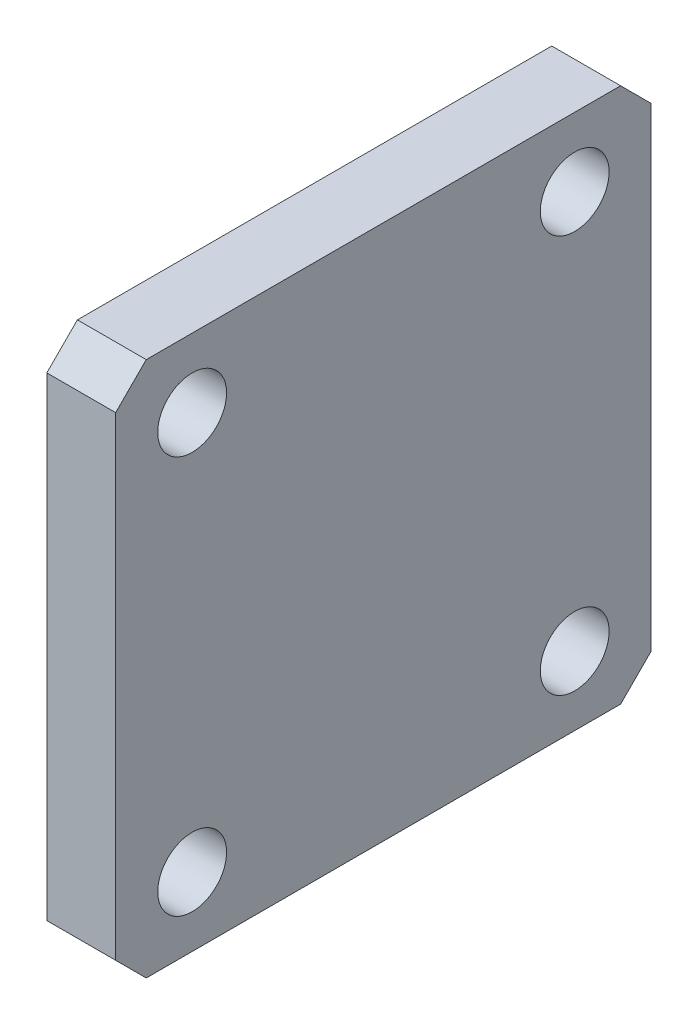
ISO-10303-21;
HEADER;
FILE_DESCRIPTION(('STEP AP214'),'2;1');
FILE_NAME('part.step','',(''),(''),'','','');
FILE_SCHEMA(('AUTOMOTIVE_DESIGN { 1 0 10303 214 1 1 1 1 }'));
ENDSEC;
DATA;
#1=APPLICATION_CONTEXT('core data for automotive mechanical design processes');
#2=APPLICATION_PROTOCOL_DEFINITION('international standard','automotive_design',2000,#1);
#3=PRODUCT_CONTEXT('',#1,'mechanical');
#4=PRODUCT('Part','Part','',(#3));
#5=PRODUCT_RELATED_PRODUCT_CATEGORY('part','',(#4));
#6=PRODUCT_DEFINITION_FORMATION('','',#4);
#7=PRODUCT_DEFINITION_CONTEXT('part definition',#1,'design');
#8=PRODUCT_DEFINITION('design','',#6,#7);
#9=PRODUCT_DEFINITION_SHAPE('','',#8);
#10=(LENGTH_UNIT() NAMED_UNIT(*) SI_UNIT(.MILLI.,.METRE.));
#11=(NAMED_UNIT(*) PLANE_ANGLE_UNIT() SI_UNIT($,.RADIAN.));
#12=(NAMED_UNIT(*) SI_UNIT($,.STERADIAN.) SOLID_ANGLE_UNIT());
#13=UNCERTAINTY_MEASURE_WITH_UNIT(LENGTH_MEASURE(1.E-05),#10,'distance_accuracy_value','');
#14=(GEOMETRIC_REPRESENTATION_CONTEXT(3) GLOBAL_UNCERTAINTY_ASSIGNED_CONTEXT((#13)) GLOBAL_UNIT_ASSIGNED_CONTEXT((#10,
#11,#12)) REPRESENTATION_CONTEXT('',''));
#15=CARTESIAN_POINT('',(0.,0.,0.));
#16=DIRECTION('',(0.,0.,1.));
#17=DIRECTION('',(1.,0.,0.));
#18=AXIS2_PLACEMENT_3D('',#15,#16,#17);
#19=CARTESIAN_POINT('',(4.5,-17.5,-17.5));
#20=DIRECTION('',(0.,0.,1.));
#21=DIRECTION('',(1.,0.,0.));
#22=AXIS2_PLACEMENT_3D('',#19,#20,#21);
#23=PLANE('',#22);
#24=DIRECTION('',(0.,1.,0.));
#25=VECTOR('',#24,1.);
#26=CARTESIAN_POINT('',(4.5,-17.5,-17.5));
#27=LINE('',#26,#25);
#28=CARTESIAN_POINT('',(4.5,-15.5,-17.5));
#29=VERTEX_POINT('',#28);
#30=CARTESIAN_POINT('',(4.5,15.5,-17.5));
#31=VERTEX_POINT('',#30);
#32=EDGE_CURVE('E118',#29,#31,#27,.T.);
#33=ORIENTED_EDGE('',*,*,#32,.F.);
#34=DIRECTION('',(-1.,0.,0.));
#35=VECTOR('',#34,1.);
#36=CARTESIAN_POINT('',(4.5,-15.5,-17.5));
#37=LINE('',#36,#35);
#38=CARTESIAN_POINT('',(0.,-15.5,-17.5));
#39=VERTEX_POINT('',#38);
#40=EDGE_CURVE('E103',#29,#39,#37,.T.);
#41=ORIENTED_EDGE('',*,*,#40,.T.);
#42=DIRECTION('',(0.,1.,0.));
#43=VECTOR('',#42,1.);
#44=CARTESIAN_POINT('',(0.,-17.5,-17.5));
#45=LINE('',#44,#43);
#46=CARTESIAN_POINT('',(0.,15.5,-17.5));
#47=VERTEX_POINT('',#46);
#48=EDGE_CURVE('E115',#39,#47,#45,.T.);
#49=ORIENTED_EDGE('',*,*,#48,.T.);
#50=DIRECTION('',(1.,0.,0.));
#51=VECTOR('',#50,1.);
#52=CARTESIAN_POINT('',(4.5,15.5,-17.5));
#53=LINE('',#52,#51);
#54=EDGE_CURVE('E120',#47,#31,#53,.T.);
#55=ORIENTED_EDGE('',*,*,#54,.T.);
#56=EDGE_LOOP('',(#33,#41,#49,#55));
#57=FACE_BOUND('',#56,.T.);
#58=ADVANCED_FACE('F32',(#57),#23,.F.);
#59=CARTESIAN_POINT('',(4.5,17.5,17.5));
#60=DIRECTION('',(0.,-1.,0.));
#61=DIRECTION('',(0.,0.,-1.));
#62=AXIS2_PLACEMENT_3D('',#59,#60,#61);
#63=PLANE('',#62);
#64=DIRECTION('',(0.,0.,1.));
#65=VECTOR('',#64,1.);
#66=CARTESIAN_POINT('',(4.5,17.5,17.5));
#67=LINE('',#66,#65);
#68=CARTESIAN_POINT('',(4.5,17.5,-15.5));
#69=VERTEX_POINT('',#68);
#70=CARTESIAN_POINT('',(4.5,17.5,15.5));
#71=VERTEX_POINT('',#70);
#72=EDGE_CURVE('E178',#69,#71,#67,.T.);
#73=ORIENTED_EDGE('',*,*,#72,.F.);
#74=DIRECTION('',(-1.,0.,0.));
#75=VECTOR('',#74,1.);
#76=CARTESIAN_POINT('',(4.5,17.5,-15.5));
#77=LINE('',#76,#75);
#78=CARTESIAN_POINT('',(0.,17.5,-15.5));
#79=VERTEX_POINT('',#78);
#80=EDGE_CURVE('E157',#69,#79,#77,.T.);
#81=ORIENTED_EDGE('',*,*,#80,.T.);
#82=DIRECTION('',(0.,0.,1.));
#83=VECTOR('',#82,1.);
#84=CARTESIAN_POINT('',(0.,17.5,17.5));
#85=LINE('',#84,#83);
#86=CARTESIAN_POINT('',(0.,17.5,15.5));
#87=VERTEX_POINT('',#86);
#88=EDGE_CURVE('E124',#79,#87,#85,.T.);
#89=ORIENTED_EDGE('',*,*,#88,.T.);
#90=DIRECTION('',(1.,0.,0.));
#91=VECTOR('',#90,1.);
#92=CARTESIAN_POINT('',(4.5,17.5,15.5));
#93=LINE('',#92,#91);
#94=EDGE_CURVE('E155',#87,#71,#93,.T.);
#95=ORIENTED_EDGE('',*,*,#94,.T.);
#96=EDGE_LOOP('',(#73,#81,#89,#95));
#97=FACE_BOUND('',#96,.T.);
#98=ADVANCED_FACE('F196',(#97),#63,.F.);
#99=CARTESIAN_POINT('',(4.5,-17.5,17.5));
#100=DIRECTION('',(0.,0.,-1.));
#101=DIRECTION('',(-1.,0.,0.));
#102=AXIS2_PLACEMENT_3D('',#99,#100,#101);
#103=PLANE('',#102);
#104=DIRECTION('',(0.,-1.,0.));
#105=VECTOR('',#104,1.);
#106=CARTESIAN_POINT('',(0.,-17.5,17.5));
#107=LINE('',#106,#105);
#108=CARTESIAN_POINT('',(0.,15.5,17.5));
#109=VERTEX_POINT('',#108);
#110=CARTESIAN_POINT('',(0.,-15.5,17.5));
#111=VERTEX_POINT('',#110);
#112=EDGE_CURVE('E128',#109,#111,#107,.T.);
#113=ORIENTED_EDGE('',*,*,#112,.T.);
#114=DIRECTION('',(1.,0.,0.));
#115=VECTOR('',#114,1.);
#116=CARTESIAN_POINT('',(4.5,-15.5,17.5));
#117=LINE('',#116,#115);
#118=CARTESIAN_POINT('',(4.5,-15.5,17.5));
#119=VERTEX_POINT('',#118);
#120=EDGE_CURVE('E11',#111,#119,#117,.T.);
#121=ORIENTED_EDGE('',*,*,#120,.T.);
#122=DIRECTION('',(0.,-1.,0.));
#123=VECTOR('',#122,1.);
#124=CARTESIAN_POINT('',(4.5,-17.5,17.5));
#125=LINE('',#124,#123);
#126=CARTESIAN_POINT('',(4.5,15.5,17.5));
#127=VERTEX_POINT('',#126);
#128=EDGE_CURVE('E179',#127,#119,#125,.T.);
#129=ORIENTED_EDGE('',*,*,#128,.F.);
#130=DIRECTION('',(-1.,0.,0.));
#131=VECTOR('',#130,1.);
#132=CARTESIAN_POINT('',(4.5,15.5,17.5));
#133=LINE('',#132,#131);
#134=EDGE_CURVE('E41',#127,#109,#133,.T.);
#135=ORIENTED_EDGE('',*,*,#134,.T.);
#136=EDGE_LOOP('',(#113,#121,#129,#135));
#137=FACE_BOUND('',#136,.T.);
#138=ADVANCED_FACE('F190',(#137),#103,.F.);
#139=CARTESIAN_POINT('',(4.5,-17.5,17.5));
#140=DIRECTION('',(0.,1.,0.));
#141=DIRECTION('',(0.,0.,1.));
#142=AXIS2_PLACEMENT_3D('',#139,#140,#141);
#143=PLANE('',#142);
#144=DIRECTION('',(0.,0.,-1.));
#145=VECTOR('',#144,1.);
#146=CARTESIAN_POINT('',(0.,-17.5,17.5));
#147=LINE('',#146,#145);
#148=CARTESIAN_POINT('',(0.,-17.5,15.5));
#149=VERTEX_POINT('',#148);
#150=CARTESIAN_POINT('',(0.,-17.5,-15.5));
#151=VERTEX_POINT('',#150);
#152=EDGE_CURVE('E138',#149,#151,#147,.T.);
#153=ORIENTED_EDGE('',*,*,#152,.T.);
#154=DIRECTION('',(1.,0.,0.));
#155=VECTOR('',#154,1.);
#156=CARTESIAN_POINT('',(4.5,-17.5,-15.5));
#157=LINE('',#156,#155);
#158=CARTESIAN_POINT('',(4.5,-17.5,-15.5));
#159=VERTEX_POINT('',#158);
#160=EDGE_CURVE('E104',#151,#159,#157,.T.);
#161=ORIENTED_EDGE('',*,*,#160,.T.);
#162=DIRECTION('',(0.,0.,-1.));
#163=VECTOR('',#162,1.);
#164=CARTESIAN_POINT('',(4.5,-17.5,17.5));
#165=LINE('',#164,#163);
#166=CARTESIAN_POINT('',(4.5,-17.5,15.5));
#167=VERTEX_POINT('',#166);
#168=EDGE_CURVE('E134',#167,#159,#165,.T.);
#169=ORIENTED_EDGE('',*,*,#168,.F.);
#170=DIRECTION('',(-1.,0.,0.));
#171=VECTOR('',#170,1.);
#172=CARTESIAN_POINT('',(4.5,-17.5,15.5));
#173=LINE('',#172,#171);
#174=EDGE_CURVE('E109',#167,#149,#173,.T.);
#175=ORIENTED_EDGE('',*,*,#174,.T.);
#176=EDGE_LOOP('',(#153,#161,#169,#175));
#177=FACE_BOUND('',#176,.T.);
#178=ADVANCED_FACE('F186',(#177),#143,.F.);
#179=CARTESIAN_POINT('',(4.5,0.,0.));
#180=DIRECTION('',(-1.,0.,0.));
#181=DIRECTION('',(0.,0.,1.));
#182=AXIS2_PLACEMENT_3D('',#179,#180,#181);
#183=PLANE('',#182);
#184=CARTESIAN_POINT('',(4.5,-13.,12.5));
#185=DIRECTION('',(1.,0.,0.));
#186=DIRECTION('',(0.,0.,-1.));
#187=AXIS2_PLACEMENT_3D('',#184,#185,#186);
#188=CIRCLE('',#187,2.25);
#189=CARTESIAN_POINT('',(4.5,-13.,10.25));
#190=VERTEX_POINT('',#189);
#191=EDGE_CURVE('E247',#190,#190,#188,.T.);
#192=ORIENTED_EDGE('',*,*,#191,.F.);
#193=EDGE_LOOP('',(#192));
#194=FACE_BOUND('',#193,.T.);
#195=CARTESIAN_POINT('',(4.5,13.,12.5));
#196=DIRECTION('',(1.,0.,0.));
#197=DIRECTION('',(0.,0.,-1.));
#198=AXIS2_PLACEMENT_3D('',#195,#196,#197);
#199=CIRCLE('',#198,2.25);
#200=CARTESIAN_POINT('',(4.5,13.,10.25));
#201=VERTEX_POINT('',#200);
#202=EDGE_CURVE('E173',#201,#201,#199,.T.);
#203=ORIENTED_EDGE('',*,*,#202,.F.);
#204=EDGE_LOOP('',(#203));
#205=FACE_BOUND('',#204,.T.);
#206=CARTESIAN_POINT('',(4.5,-13.,-12.5));
#207=DIRECTION('',(1.,0.,0.));
#208=DIRECTION('',(0.,0.,-1.));
#209=AXIS2_PLACEMENT_3D('',#206,#207,#208);
#210=CIRCLE('',#209,2.25);
#211=CARTESIAN_POINT('',(4.5,-13.,-14.75));
#212=VERTEX_POINT('',#211);
#213=EDGE_CURVE('E163',#212,#212,#210,.T.);
#214=ORIENTED_EDGE('',*,*,#213,.F.);
#215=EDGE_LOOP('',(#214));
#216=FACE_BOUND('',#215,.T.);
#217=CARTESIAN_POINT('',(4.5,13.,-12.5));
#218=DIRECTION('',(1.,0.,0.));
#219=DIRECTION('',(0.,0.,-1.));
#220=AXIS2_PLACEMENT_3D('',#217,#218,#219);
#221=CIRCLE('',#220,2.25);
#222=CARTESIAN_POINT('',(4.5,13.,-14.75));
#223=VERTEX_POINT('',#222);
#224=EDGE_CURVE('E131',#223,#223,#221,.T.);
#225=ORIENTED_EDGE('',*,*,#224,.F.);
#226=EDGE_LOOP('',(#225));
#227=FACE_BOUND('',#226,.T.);
#228=ORIENTED_EDGE('',*,*,#168,.T.);
#229=DIRECTION('',(0.,-0.707106781186546,0.707106781186549));
#230=VECTOR('',#229,1.);
#231=CARTESIAN_POINT('',(4.5,-15.5,-17.5));
#232=LINE('',#231,#230);
#233=EDGE_CURVE('E153',#159,#29,#232,.F.);
#234=ORIENTED_EDGE('',*,*,#233,.T.);
#235=ORIENTED_EDGE('',*,*,#32,.T.);
#236=DIRECTION('',(0.,-0.70710678118655,-0.707106781186545));
#237=VECTOR('',#236,1.);
#238=CARTESIAN_POINT('',(4.5,17.5,-15.5));
#239=LINE('',#238,#237);
#240=EDGE_CURVE('E151',#31,#69,#239,.F.);
#241=ORIENTED_EDGE('',*,*,#240,.T.);
#242=ORIENTED_EDGE('',*,*,#72,.T.);
#243=DIRECTION('',(0.,0.707106781186546,-0.707106781186549));
#244=VECTOR('',#243,1.);
#245=CARTESIAN_POINT('',(4.5,15.5,17.5));
#246=LINE('',#245,#244);
#247=EDGE_CURVE('E54',#71,#127,#246,.F.);
#248=ORIENTED_EDGE('',*,*,#247,.T.);
#249=ORIENTED_EDGE('',*,*,#128,.T.);
#250=DIRECTION('',(0.,0.70710678118655,0.707106781186545));
#251=VECTOR('',#250,1.);
#252=CARTESIAN_POINT('',(4.5,-17.5,15.5));
#253=LINE('',#252,#251);
#254=EDGE_CURVE('E149',#119,#167,#253,.F.);
#255=ORIENTED_EDGE('',*,*,#254,.T.);
#256=EDGE_LOOP('',(#228,#234,#235,#241,#242,#248,#249,#255));
#257=FACE_BOUND('',#256,.T.);
#258=ADVANCED_FACE('F183',(#194,#205,#216,#227,#257),#183,.F.);
#259=CARTESIAN_POINT('',(0.,0.,0.));
#260=DIRECTION('',(-1.,0.,0.));
#261=DIRECTION('',(0.,0.,1.));
#262=AXIS2_PLACEMENT_3D('',#259,#260,#261);
#263=PLANE('',#262);
#264=CARTESIAN_POINT('',(0.,-13.,12.5));
#265=DIRECTION('',(-1.,0.,0.));
#266=DIRECTION('',(0.,0.,1.));
#267=AXIS2_PLACEMENT_3D('',#264,#265,#266);
#268=CIRCLE('',#267,2.25);
#269=CARTESIAN_POINT('',(0.,-13.,14.75));
#270=VERTEX_POINT('',#269);
#271=EDGE_CURVE('E244',#270,#270,#268,.T.);
#272=ORIENTED_EDGE('',*,*,#271,.F.);
#273=EDGE_LOOP('',(#272));
#274=FACE_BOUND('',#273,.T.);
#275=CARTESIAN_POINT('',(0.,13.,12.5));
#276=DIRECTION('',(-1.,0.,0.));
#277=DIRECTION('',(0.,0.,1.));
#278=AXIS2_PLACEMENT_3D('',#275,#276,#277);
#279=CIRCLE('',#278,2.25);
#280=CARTESIAN_POINT('',(0.,13.,14.75));
#281=VERTEX_POINT('',#280);
#282=EDGE_CURVE('E36',#281,#281,#279,.T.);
#283=ORIENTED_EDGE('',*,*,#282,.F.);
#284=EDGE_LOOP('',(#283));
#285=FACE_BOUND('',#284,.T.);
#286=CARTESIAN_POINT('',(0.,-13.,-12.5));
#287=DIRECTION('',(-1.,0.,0.));
#288=DIRECTION('',(0.,0.,1.));
#289=AXIS2_PLACEMENT_3D('',#286,#287,#288);
#290=CIRCLE('',#289,2.25);
#291=CARTESIAN_POINT('',(0.,-13.,-10.25));
#292=VERTEX_POINT('',#291);
#293=EDGE_CURVE('E161',#292,#292,#290,.T.);
#294=ORIENTED_EDGE('',*,*,#293,.F.);
#295=EDGE_LOOP('',(#294));
#296=FACE_BOUND('',#295,.T.);
#297=CARTESIAN_POINT('',(0.,13.,-12.5));
#298=DIRECTION('',(-1.,0.,0.));
#299=DIRECTION('',(0.,0.,1.));
#300=AXIS2_PLACEMENT_3D('',#297,#298,#299);
#301=CIRCLE('',#300,2.25);
#302=CARTESIAN_POINT('',(0.,13.,-10.25));
#303=VERTEX_POINT('',#302);
#304=EDGE_CURVE('E125',#303,#303,#301,.T.);
#305=ORIENTED_EDGE('',*,*,#304,.F.);
#306=EDGE_LOOP('',(#305));
#307=FACE_BOUND('',#306,.T.);
#308=ORIENTED_EDGE('',*,*,#48,.F.);
#309=DIRECTION('',(0.,0.707106781186546,-0.707106781186549));
#310=VECTOR('',#309,1.);
#311=CARTESIAN_POINT('',(0.,-16.5,-16.5));
#312=LINE('',#311,#310);
#313=EDGE_CURVE('E99',#39,#151,#312,.F.);
#314=ORIENTED_EDGE('',*,*,#313,.T.);
#315=ORIENTED_EDGE('',*,*,#152,.F.);
#316=DIRECTION('',(0.,-0.70710678118655,-0.707106781186545));
#317=VECTOR('',#316,1.);
#318=CARTESIAN_POINT('',(0.,-16.5,16.5000000000001));
#319=LINE('',#318,#317);
#320=EDGE_CURVE('E142',#149,#111,#319,.F.);
#321=ORIENTED_EDGE('',*,*,#320,.T.);
#322=ORIENTED_EDGE('',*,*,#112,.F.);
#323=DIRECTION('',(0.,-0.707106781186546,0.707106781186549));
#324=VECTOR('',#323,1.);
#325=CARTESIAN_POINT('',(0.,16.5,16.5));
#326=LINE('',#325,#324);
#327=EDGE_CURVE('E119',#109,#87,#326,.F.);
#328=ORIENTED_EDGE('',*,*,#327,.T.);
#329=ORIENTED_EDGE('',*,*,#88,.F.);
#330=DIRECTION('',(0.,0.70710678118655,0.707106781186545));
#331=VECTOR('',#330,1.);
#332=CARTESIAN_POINT('',(0.,16.4999999999999,-16.5000000000001));
#333=LINE('',#332,#331);
#334=EDGE_CURVE('E110',#79,#47,#333,.F.);
#335=ORIENTED_EDGE('',*,*,#334,.T.);
#336=EDGE_LOOP('',(#308,#314,#315,#321,#322,#328,#329,#335));
#337=FACE_BOUND('',#336,.T.);
#338=ADVANCED_FACE('F122',(#274,#285,#296,#307,#337),#263,.T.);
#339=CARTESIAN_POINT('',(4.5,-15.5,-17.5));
#340=DIRECTION('',(0.,0.707106781186549,0.707106781186546));
#341=DIRECTION('',(-1.,0.,0.));
#342=AXIS2_PLACEMENT_3D('',#339,#340,#341);
#343=PLANE('',#342);
#344=ORIENTED_EDGE('',*,*,#233,.F.);
#345=ORIENTED_EDGE('',*,*,#160,.F.);
#346=ORIENTED_EDGE('',*,*,#313,.F.);
#347=ORIENTED_EDGE('',*,*,#40,.F.);
#348=EDGE_LOOP('',(#344,#345,#346,#347));
#349=FACE_BOUND('',#348,.T.);
#350=ADVANCED_FACE('F102',(#349),#343,.F.);
#351=CARTESIAN_POINT('',(4.5,17.5,-15.5));
#352=DIRECTION('',(0.,-0.707106781186545,0.70710678118655));
#353=DIRECTION('',(-1.,0.,0.));
#354=AXIS2_PLACEMENT_3D('',#351,#352,#353);
#355=PLANE('',#354);
#356=ORIENTED_EDGE('',*,*,#240,.F.);
#357=ORIENTED_EDGE('',*,*,#54,.F.);
#358=ORIENTED_EDGE('',*,*,#334,.F.);
#359=ORIENTED_EDGE('',*,*,#80,.F.);
#360=EDGE_LOOP('',(#356,#357,#358,#359));
#361=FACE_BOUND('',#360,.T.);
#362=ADVANCED_FACE('F200',(#361),#355,.F.);
#363=CARTESIAN_POINT('',(4.5,-17.5,15.5));
#364=DIRECTION('',(0.,0.707106781186545,-0.70710678118655));
#365=DIRECTION('',(-1.,0.,0.));
#366=AXIS2_PLACEMENT_3D('',#363,#364,#365);
#367=PLANE('',#366);
#368=ORIENTED_EDGE('',*,*,#254,.F.);
#369=ORIENTED_EDGE('',*,*,#120,.F.);
#370=ORIENTED_EDGE('',*,*,#320,.F.);
#371=ORIENTED_EDGE('',*,*,#174,.F.);
#372=EDGE_LOOP('',(#368,#369,#370,#371));
#373=FACE_BOUND('',#372,.T.);
#374=ADVANCED_FACE('F188',(#373),#367,.F.);
#375=CARTESIAN_POINT('',(4.5,15.5,17.5));
#376=DIRECTION('',(0.,-0.707106781186549,-0.707106781186546));
#377=DIRECTION('',(-1.,0.,0.));
#378=AXIS2_PLACEMENT_3D('',#375,#376,#377);
#379=PLANE('',#378);
#380=ORIENTED_EDGE('',*,*,#247,.F.);
#381=ORIENTED_EDGE('',*,*,#94,.F.);
#382=ORIENTED_EDGE('',*,*,#327,.F.);
#383=ORIENTED_EDGE('',*,*,#134,.F.);
#384=EDGE_LOOP('',(#380,#381,#382,#383));
#385=FACE_BOUND('',#384,.T.);
#386=ADVANCED_FACE('F34',(#385),#379,.F.);
#387=CARTESIAN_POINT('',(4.5,13.,-12.5));
#388=DIRECTION('',(1.,0.,0.));
#389=DIRECTION('',(0.,0.,-1.));
#390=AXIS2_PLACEMENT_3D('',#387,#388,#389);
#391=CYLINDRICAL_SURFACE('',#390,2.25);
#392=ORIENTED_EDGE('',*,*,#304,.T.);
#393=EDGE_LOOP('',(#392));
#394=FACE_BOUND('',#393,.T.);
#395=ORIENTED_EDGE('',*,*,#224,.T.);
#396=EDGE_LOOP('',(#395));
#397=FACE_BOUND('',#396,.T.);
#398=ADVANCED_FACE('F225',(#394,#397),#391,.F.);
#399=CARTESIAN_POINT('',(4.5,-13.,-12.5));
#400=DIRECTION('',(1.,0.,0.));
#401=DIRECTION('',(0.,0.,-1.));
#402=AXIS2_PLACEMENT_3D('',#399,#400,#401);
#403=CYLINDRICAL_SURFACE('',#402,2.25);
#404=ORIENTED_EDGE('',*,*,#293,.T.);
#405=EDGE_LOOP('',(#404));
#406=FACE_BOUND('',#405,.T.);
#407=ORIENTED_EDGE('',*,*,#213,.T.);
#408=EDGE_LOOP('',(#407));
#409=FACE_BOUND('',#408,.T.);
#410=ADVANCED_FACE('F228',(#406,#409),#403,.F.);
#411=CARTESIAN_POINT('',(4.5,13.,12.5));
#412=DIRECTION('',(1.,0.,0.));
#413=DIRECTION('',(0.,0.,-1.));
#414=AXIS2_PLACEMENT_3D('',#411,#412,#413);
#415=CYLINDRICAL_SURFACE('',#414,2.25);
#416=ORIENTED_EDGE('',*,*,#282,.T.);
#417=EDGE_LOOP('',(#416));
#418=FACE_BOUND('',#417,.T.);
#419=ORIENTED_EDGE('',*,*,#202,.T.);
#420=EDGE_LOOP('',(#419));
#421=FACE_BOUND('',#420,.T.);
#422=ADVANCED_FACE('F232',(#418,#421),#415,.F.);
#423=CARTESIAN_POINT('',(4.5,-13.,12.5));
#424=DIRECTION('',(1.,0.,0.));
#425=DIRECTION('',(0.,0.,-1.));
#426=AXIS2_PLACEMENT_3D('',#423,#424,#425);
#427=CYLINDRICAL_SURFACE('',#426,2.25);
#428=ORIENTED_EDGE('',*,*,#271,.T.);
#429=EDGE_LOOP('',(#428));
#430=FACE_BOUND('',#429,.T.);
#431=ORIENTED_EDGE('',*,*,#191,.T.);
#432=EDGE_LOOP('',(#431));
#433=FACE_BOUND('',#432,.T.);
#434=ADVANCED_FACE('F235',(#430,#433),#427,.F.);
#435=CLOSED_SHELL('',(#58,#98,#138,#178,#258,#338,#350,#362,#374,#386,#398,#410,#422,#434));
#436=MANIFOLD_SOLID_BREP('B2',#435);
#437=ADVANCED_BREP_SHAPE_REPRESENTATION('',(#18,#436),#14);
#438=SHAPE_DEFINITION_REPRESENTATION(#9,#437);
ENDSEC;
END-ISO-10303-21;
